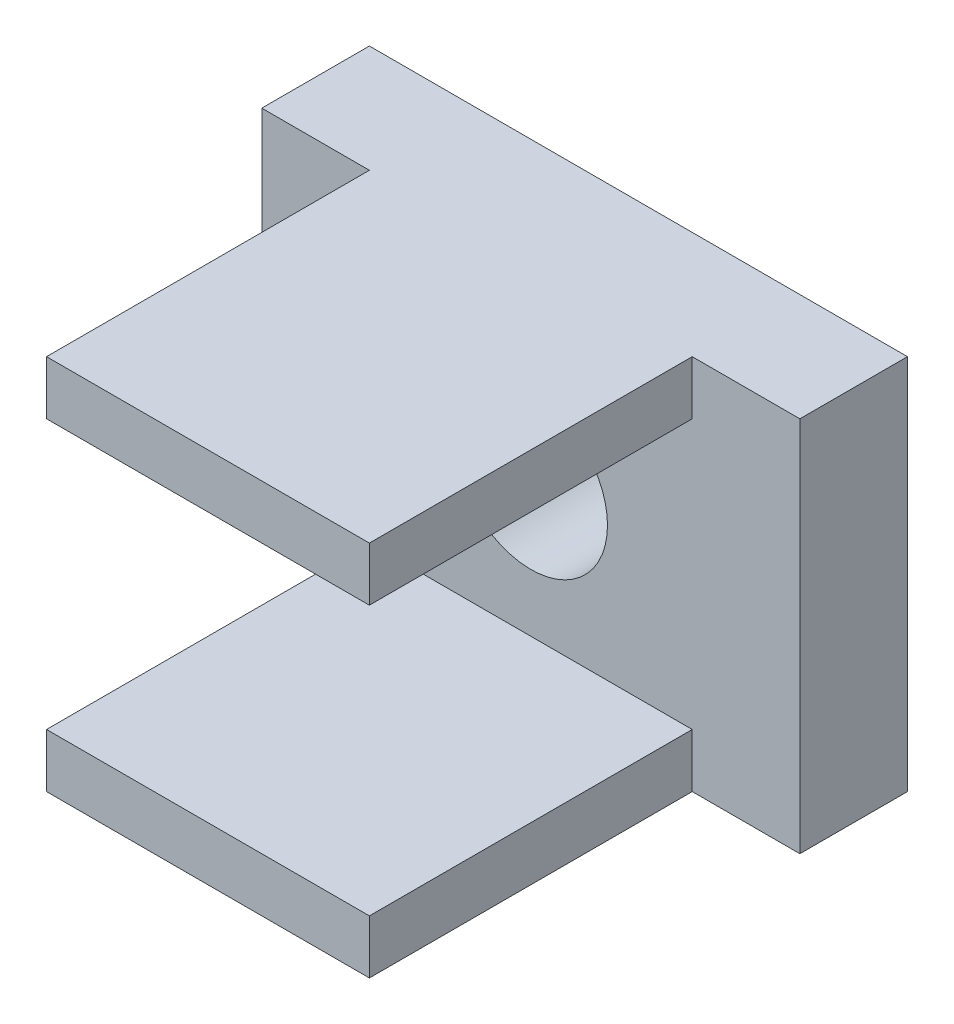
ISO-10303-21;
HEADER;
FILE_DESCRIPTION(('STEP AP214'),'2;1');
FILE_NAME('part.step','',(''),(''),'','','');
FILE_SCHEMA(('AUTOMOTIVE_DESIGN { 1 0 10303 214 1 1 1 1 }'));
ENDSEC;
DATA;
#1=APPLICATION_CONTEXT('core data for automotive mechanical design processes');
#2=APPLICATION_PROTOCOL_DEFINITION('international standard','automotive_design',2000,#1);
#3=PRODUCT_CONTEXT('',#1,'mechanical');
#4=PRODUCT('Part','Part','',(#3));
#5=PRODUCT_RELATED_PRODUCT_CATEGORY('part','',(#4));
#6=PRODUCT_DEFINITION_FORMATION('','',#4);
#7=PRODUCT_DEFINITION_CONTEXT('part definition',#1,'design');
#8=PRODUCT_DEFINITION('design','',#6,#7);
#9=PRODUCT_DEFINITION_SHAPE('','',#8);
#10=(LENGTH_UNIT() NAMED_UNIT(*) SI_UNIT(.MILLI.,.METRE.));
#11=(NAMED_UNIT(*) PLANE_ANGLE_UNIT() SI_UNIT($,.RADIAN.));
#12=(NAMED_UNIT(*) SI_UNIT($,.STERADIAN.) SOLID_ANGLE_UNIT());
#13=UNCERTAINTY_MEASURE_WITH_UNIT(LENGTH_MEASURE(1.E-05),#10,'distance_accuracy_value','');
#14=(GEOMETRIC_REPRESENTATION_CONTEXT(3) GLOBAL_UNCERTAINTY_ASSIGNED_CONTEXT((#13)) GLOBAL_UNIT_ASSIGNED_CONTEXT((#10,
#11,#12)) REPRESENTATION_CONTEXT('',''));
#15=CARTESIAN_POINT('',(0.,0.,0.));
#16=DIRECTION('',(0.,0.,1.));
#17=DIRECTION('',(1.,0.,0.));
#18=AXIS2_PLACEMENT_3D('',#15,#16,#17);
#19=CARTESIAN_POINT('',(-5.,-3.5,2.));
#20=DIRECTION('',(1.,0.,0.));
#21=DIRECTION('',(0.,0.,-1.));
#22=AXIS2_PLACEMENT_3D('',#19,#20,#21);
#23=PLANE('',#22);
#24=DIRECTION('',(0.,-1.,0.));
#25=VECTOR('',#24,1.);
#26=CARTESIAN_POINT('',(-5.,-3.5,0.));
#27=LINE('',#26,#25);
#28=CARTESIAN_POINT('',(-5.,3.5,0.));
#29=VERTEX_POINT('',#28);
#30=CARTESIAN_POINT('',(-5.,-3.5,0.));
#31=VERTEX_POINT('',#30);
#32=EDGE_CURVE('E220',#29,#31,#27,.T.);
#33=ORIENTED_EDGE('',*,*,#32,.T.);
#34=DIRECTION('',(0.,0.,-1.));
#35=VECTOR('',#34,1.);
#36=CARTESIAN_POINT('',(-5.,-3.5,2.));
#37=LINE('',#36,#35);
#38=CARTESIAN_POINT('',(-5.,-3.5,2.));
#39=VERTEX_POINT('',#38);
#40=EDGE_CURVE('E11',#39,#31,#37,.T.);
#41=ORIENTED_EDGE('',*,*,#40,.F.);
#42=DIRECTION('',(0.,-1.,0.));
#43=VECTOR('',#42,1.);
#44=CARTESIAN_POINT('',(-5.,-3.5,2.));
#45=LINE('',#44,#43);
#46=CARTESIAN_POINT('',(-5.,3.5,2.));
#47=VERTEX_POINT('',#46);
#48=EDGE_CURVE('E224',#47,#39,#45,.T.);
#49=ORIENTED_EDGE('',*,*,#48,.F.);
#50=DIRECTION('',(0.,0.,-1.));
#51=VECTOR('',#50,1.);
#52=CARTESIAN_POINT('',(-5.,3.5,2.));
#53=LINE('',#52,#51);
#54=EDGE_CURVE('E240',#47,#29,#53,.T.);
#55=ORIENTED_EDGE('',*,*,#54,.T.);
#56=EDGE_LOOP('',(#33,#41,#49,#55));
#57=FACE_BOUND('',#56,.T.);
#58=ADVANCED_FACE('F39',(#57),#23,.F.);
#59=CARTESIAN_POINT('',(5.,-3.5,2.));
#60=DIRECTION('',(0.,1.,0.));
#61=DIRECTION('',(-1.,0.,0.));
#62=AXIS2_PLACEMENT_3D('',#59,#60,#61);
#63=PLANE('',#62);
#64=DIRECTION('',(1.,0.,0.));
#65=VECTOR('',#64,1.);
#66=CARTESIAN_POINT('',(5.,-3.5,0.));
#67=LINE('',#66,#65);
#68=CARTESIAN_POINT('',(5.,-3.5,0.));
#69=VERTEX_POINT('',#68);
#70=EDGE_CURVE('E244',#31,#69,#67,.T.);
#71=ORIENTED_EDGE('',*,*,#70,.T.);
#72=DIRECTION('',(0.,0.,-1.));
#73=VECTOR('',#72,1.);
#74=CARTESIAN_POINT('',(5.,-3.5,2.));
#75=LINE('',#74,#73);
#76=CARTESIAN_POINT('',(5.,-3.5,2.));
#77=VERTEX_POINT('',#76);
#78=EDGE_CURVE('E47',#77,#69,#75,.T.);
#79=ORIENTED_EDGE('',*,*,#78,.F.);
#80=DIRECTION('',(1.,0.,0.));
#81=VECTOR('',#80,1.);
#82=CARTESIAN_POINT('',(5.,-3.5,2.));
#83=LINE('',#82,#81);
#84=CARTESIAN_POINT('',(3.,-3.5,2.));
#85=VERTEX_POINT('',#84);
#86=EDGE_CURVE('E228',#85,#77,#83,.T.);
#87=ORIENTED_EDGE('',*,*,#86,.F.);
#88=DIRECTION('',(0.,0.,-1.));
#89=VECTOR('',#88,1.);
#90=CARTESIAN_POINT('',(3.,-3.5,8.));
#91=LINE('',#90,#89);
#92=CARTESIAN_POINT('',(3.,-3.5,8.));
#93=VERTEX_POINT('',#92);
#94=EDGE_CURVE('E139',#93,#85,#91,.T.);
#95=ORIENTED_EDGE('',*,*,#94,.F.);
#96=DIRECTION('',(-1.,0.,0.));
#97=VECTOR('',#96,1.);
#98=CARTESIAN_POINT('',(-3.,-3.5,8.));
#99=LINE('',#98,#97);
#100=CARTESIAN_POINT('',(-3.,-3.5,8.));
#101=VERTEX_POINT('',#100);
#102=EDGE_CURVE('E145',#93,#101,#99,.T.);
#103=ORIENTED_EDGE('',*,*,#102,.T.);
#104=DIRECTION('',(0.,0.,-1.));
#105=VECTOR('',#104,1.);
#106=CARTESIAN_POINT('',(-3.,-3.5,8.));
#107=LINE('',#106,#105);
#108=CARTESIAN_POINT('',(-3.,-3.5,2.));
#109=VERTEX_POINT('',#108);
#110=EDGE_CURVE('E128',#101,#109,#107,.T.);
#111=ORIENTED_EDGE('',*,*,#110,.T.);
#112=EDGE_CURVE('E230',#39,#109,#83,.T.);
#113=ORIENTED_EDGE('',*,*,#112,.F.);
#114=ORIENTED_EDGE('',*,*,#40,.T.);
#115=EDGE_LOOP('',(#71,#79,#87,#95,#103,#111,#113,#114));
#116=FACE_BOUND('',#115,.T.);
#117=ADVANCED_FACE('F151',(#116),#63,.F.);
#118=CARTESIAN_POINT('',(5.,-3.5,2.));
#119=DIRECTION('',(-1.,0.,0.));
#120=DIRECTION('',(0.,0.,1.));
#121=AXIS2_PLACEMENT_3D('',#118,#119,#120);
#122=PLANE('',#121);
#123=DIRECTION('',(0.,1.,0.));
#124=VECTOR('',#123,1.);
#125=CARTESIAN_POINT('',(5.,-3.5,0.));
#126=LINE('',#125,#124);
#127=CARTESIAN_POINT('',(5.,3.5,0.));
#128=VERTEX_POINT('',#127);
#129=EDGE_CURVE('E247',#69,#128,#126,.T.);
#130=ORIENTED_EDGE('',*,*,#129,.T.);
#131=DIRECTION('',(0.,0.,-1.));
#132=VECTOR('',#131,1.);
#133=CARTESIAN_POINT('',(5.,3.5,2.));
#134=LINE('',#133,#132);
#135=CARTESIAN_POINT('',(5.,3.5,2.));
#136=VERTEX_POINT('',#135);
#137=EDGE_CURVE('E255',#136,#128,#134,.T.);
#138=ORIENTED_EDGE('',*,*,#137,.F.);
#139=DIRECTION('',(0.,1.,0.));
#140=VECTOR('',#139,1.);
#141=CARTESIAN_POINT('',(5.,-3.5,2.));
#142=LINE('',#141,#140);
#143=EDGE_CURVE('E233',#77,#136,#142,.T.);
#144=ORIENTED_EDGE('',*,*,#143,.F.);
#145=ORIENTED_EDGE('',*,*,#78,.T.);
#146=EDGE_LOOP('',(#130,#138,#144,#145));
#147=FACE_BOUND('',#146,.T.);
#148=ADVANCED_FACE('F264',(#147),#122,.F.);
#149=CARTESIAN_POINT('',(5.,3.5,2.));
#150=DIRECTION('',(0.,-1.,0.));
#151=DIRECTION('',(1.,0.,0.));
#152=AXIS2_PLACEMENT_3D('',#149,#150,#151);
#153=PLANE('',#152);
#154=DIRECTION('',(-1.,0.,0.));
#155=VECTOR('',#154,1.);
#156=CARTESIAN_POINT('',(5.,3.5,0.));
#157=LINE('',#156,#155);
#158=EDGE_CURVE('E229',#128,#29,#157,.T.);
#159=ORIENTED_EDGE('',*,*,#158,.T.);
#160=ORIENTED_EDGE('',*,*,#54,.F.);
#161=DIRECTION('',(-1.,0.,0.));
#162=VECTOR('',#161,1.);
#163=CARTESIAN_POINT('',(5.,3.5,2.));
#164=LINE('',#163,#162);
#165=CARTESIAN_POINT('',(-3.,3.5,2.));
#166=VERTEX_POINT('',#165);
#167=EDGE_CURVE('E236',#166,#47,#164,.T.);
#168=ORIENTED_EDGE('',*,*,#167,.F.);
#169=DIRECTION('',(0.,0.,-1.));
#170=VECTOR('',#169,1.);
#171=CARTESIAN_POINT('',(-3.,3.5,8.));
#172=LINE('',#171,#170);
#173=CARTESIAN_POINT('',(-3.,3.5,8.));
#174=VERTEX_POINT('',#173);
#175=EDGE_CURVE('E189',#174,#166,#172,.T.);
#176=ORIENTED_EDGE('',*,*,#175,.F.);
#177=DIRECTION('',(-1.,0.,0.));
#178=VECTOR('',#177,1.);
#179=CARTESIAN_POINT('',(-3.,3.5,8.));
#180=LINE('',#179,#178);
#181=CARTESIAN_POINT('',(3.,3.5,8.));
#182=VERTEX_POINT('',#181);
#183=EDGE_CURVE('E186',#182,#174,#180,.T.);
#184=ORIENTED_EDGE('',*,*,#183,.F.);
#185=DIRECTION('',(0.,0.,-1.));
#186=VECTOR('',#185,1.);
#187=CARTESIAN_POINT('',(3.,3.5,8.));
#188=LINE('',#187,#186);
#189=CARTESIAN_POINT('',(3.,3.5,2.));
#190=VERTEX_POINT('',#189);
#191=EDGE_CURVE('E203',#182,#190,#188,.T.);
#192=ORIENTED_EDGE('',*,*,#191,.T.);
#193=EDGE_CURVE('E237',#136,#190,#164,.T.);
#194=ORIENTED_EDGE('',*,*,#193,.F.);
#195=ORIENTED_EDGE('',*,*,#137,.T.);
#196=EDGE_LOOP('',(#159,#160,#168,#176,#184,#192,#194,#195));
#197=FACE_BOUND('',#196,.T.);
#198=ADVANCED_FACE('F272',(#197),#153,.F.);
#199=CARTESIAN_POINT('',(0.,0.,2.));
#200=DIRECTION('',(0.,0.,1.));
#201=DIRECTION('',(1.,0.,0.));
#202=AXIS2_PLACEMENT_3D('',#199,#200,#201);
#203=PLANE('',#202);
#204=DIRECTION('',(0.,1.,0.));
#205=VECTOR('',#204,1.);
#206=CARTESIAN_POINT('',(-3.,-3.5,2.));
#207=LINE('',#206,#205);
#208=CARTESIAN_POINT('',(-3.,-2.5,2.));
#209=VERTEX_POINT('',#208);
#210=EDGE_CURVE('E134',#109,#209,#207,.T.);
#211=ORIENTED_EDGE('',*,*,#210,.T.);
#212=DIRECTION('',(1.,0.,0.));
#213=VECTOR('',#212,1.);
#214=CARTESIAN_POINT('',(-3.,-2.5,2.));
#215=LINE('',#214,#213);
#216=CARTESIAN_POINT('',(3.,-2.5,2.));
#217=VERTEX_POINT('',#216);
#218=EDGE_CURVE('E54',#209,#217,#215,.T.);
#219=ORIENTED_EDGE('',*,*,#218,.T.);
#220=DIRECTION('',(0.,-1.,0.));
#221=VECTOR('',#220,1.);
#222=CARTESIAN_POINT('',(3.,-3.5,2.));
#223=LINE('',#222,#221);
#224=EDGE_CURVE('E59',#217,#85,#223,.T.);
#225=ORIENTED_EDGE('',*,*,#224,.T.);
#226=ORIENTED_EDGE('',*,*,#86,.T.);
#227=ORIENTED_EDGE('',*,*,#143,.T.);
#228=ORIENTED_EDGE('',*,*,#193,.T.);
#229=DIRECTION('',(0.,1.,0.));
#230=VECTOR('',#229,1.);
#231=CARTESIAN_POINT('',(3.,3.5,2.));
#232=LINE('',#231,#230);
#233=CARTESIAN_POINT('',(3.,2.5,2.));
#234=VERTEX_POINT('',#233);
#235=EDGE_CURVE('E180',#234,#190,#232,.T.);
#236=ORIENTED_EDGE('',*,*,#235,.F.);
#237=DIRECTION('',(1.,0.,0.));
#238=VECTOR('',#237,1.);
#239=CARTESIAN_POINT('',(-3.,2.5,2.));
#240=LINE('',#239,#238);
#241=CARTESIAN_POINT('',(-3.,2.5,2.));
#242=VERTEX_POINT('',#241);
#243=EDGE_CURVE('E193',#242,#234,#240,.T.);
#244=ORIENTED_EDGE('',*,*,#243,.F.);
#245=DIRECTION('',(0.,-1.,0.));
#246=VECTOR('',#245,1.);
#247=CARTESIAN_POINT('',(-3.,3.5,2.));
#248=LINE('',#247,#246);
#249=EDGE_CURVE('E138',#166,#242,#248,.T.);
#250=ORIENTED_EDGE('',*,*,#249,.F.);
#251=ORIENTED_EDGE('',*,*,#167,.T.);
#252=ORIENTED_EDGE('',*,*,#48,.T.);
#253=ORIENTED_EDGE('',*,*,#112,.T.);
#254=EDGE_LOOP('',(#211,#219,#225,#226,#227,#228,#236,#244,#250,#251,#252,#253));
#255=FACE_BOUND('',#254,.T.);
#256=CARTESIAN_POINT('',(0.,0.,2.));
#257=DIRECTION('',(0.,0.,1.));
#258=DIRECTION('',(1.,0.,0.));
#259=AXIS2_PLACEMENT_3D('',#256,#257,#258);
#260=CIRCLE('',#259,1.425);
#261=CARTESIAN_POINT('',(1.425,0.,2.));
#262=VERTEX_POINT('',#261);
#263=EDGE_CURVE('E215',#262,#262,#260,.T.);
#264=ORIENTED_EDGE('',*,*,#263,.F.);
#265=EDGE_LOOP('',(#264));
#266=FACE_BOUND('',#265,.T.);
#267=ADVANCED_FACE('F278',(#255,#266),#203,.T.);
#268=CARTESIAN_POINT('',(0.,0.,0.));
#269=DIRECTION('',(0.,0.,1.));
#270=DIRECTION('',(1.,0.,0.));
#271=AXIS2_PLACEMENT_3D('',#268,#269,#270);
#272=PLANE('',#271);
#273=CARTESIAN_POINT('',(0.,0.,0.));
#274=DIRECTION('',(0.,0.,1.));
#275=DIRECTION('',(1.,0.,0.));
#276=AXIS2_PLACEMENT_3D('',#273,#274,#275);
#277=CIRCLE('',#276,1.425);
#278=CARTESIAN_POINT('',(1.425,0.,0.));
#279=VERTEX_POINT('',#278);
#280=EDGE_CURVE('E216',#279,#279,#277,.T.);
#281=ORIENTED_EDGE('',*,*,#280,.T.);
#282=EDGE_LOOP('',(#281));
#283=FACE_BOUND('',#282,.T.);
#284=ORIENTED_EDGE('',*,*,#32,.F.);
#285=ORIENTED_EDGE('',*,*,#158,.F.);
#286=ORIENTED_EDGE('',*,*,#129,.F.);
#287=ORIENTED_EDGE('',*,*,#70,.F.);
#288=EDGE_LOOP('',(#284,#285,#286,#287));
#289=FACE_BOUND('',#288,.T.);
#290=ADVANCED_FACE('F269',(#283,#289),#272,.F.);
#291=CARTESIAN_POINT('',(0.,0.,0.));
#292=DIRECTION('',(0.,0.,1.));
#293=DIRECTION('',(1.,0.,0.));
#294=AXIS2_PLACEMENT_3D('',#291,#292,#293);
#295=CYLINDRICAL_SURFACE('',#294,1.425);
#296=ORIENTED_EDGE('',*,*,#280,.F.);
#297=EDGE_LOOP('',(#296));
#298=FACE_BOUND('',#297,.T.);
#299=ORIENTED_EDGE('',*,*,#263,.T.);
#300=EDGE_LOOP('',(#299));
#301=FACE_BOUND('',#300,.T.);
#302=ADVANCED_FACE('F308',(#298,#301),#295,.F.);
#303=CARTESIAN_POINT('',(-3.,3.5,8.));
#304=DIRECTION('',(1.,0.,0.));
#305=DIRECTION('',(0.,0.,-1.));
#306=AXIS2_PLACEMENT_3D('',#303,#304,#305);
#307=PLANE('',#306);
#308=ORIENTED_EDGE('',*,*,#249,.T.);
#309=DIRECTION('',(0.,0.,-1.));
#310=VECTOR('',#309,1.);
#311=CARTESIAN_POINT('',(-3.,2.5,8.));
#312=LINE('',#311,#310);
#313=CARTESIAN_POINT('',(-3.,2.5,8.));
#314=VERTEX_POINT('',#313);
#315=EDGE_CURVE('E211',#314,#242,#312,.T.);
#316=ORIENTED_EDGE('',*,*,#315,.F.);
#317=DIRECTION('',(0.,-1.,0.));
#318=VECTOR('',#317,1.);
#319=CARTESIAN_POINT('',(-3.,3.5,8.));
#320=LINE('',#319,#318);
#321=EDGE_CURVE('E175',#174,#314,#320,.T.);
#322=ORIENTED_EDGE('',*,*,#321,.F.);
#323=ORIENTED_EDGE('',*,*,#175,.T.);
#324=EDGE_LOOP('',(#308,#316,#322,#323));
#325=FACE_BOUND('',#324,.T.);
#326=ADVANCED_FACE('F314',(#325),#307,.F.);
#327=CARTESIAN_POINT('',(-3.,2.5,8.));
#328=DIRECTION('',(0.,1.,0.));
#329=DIRECTION('',(-1.,0.,0.));
#330=AXIS2_PLACEMENT_3D('',#327,#328,#329);
#331=PLANE('',#330);
#332=ORIENTED_EDGE('',*,*,#243,.T.);
#333=DIRECTION('',(0.,0.,-1.));
#334=VECTOR('',#333,1.);
#335=CARTESIAN_POINT('',(3.,2.5,8.));
#336=LINE('',#335,#334);
#337=CARTESIAN_POINT('',(3.,2.5,8.));
#338=VERTEX_POINT('',#337);
#339=EDGE_CURVE('E207',#338,#234,#336,.T.);
#340=ORIENTED_EDGE('',*,*,#339,.F.);
#341=DIRECTION('',(1.,0.,0.));
#342=VECTOR('',#341,1.);
#343=CARTESIAN_POINT('',(-3.,2.5,8.));
#344=LINE('',#343,#342);
#345=EDGE_CURVE('E179',#314,#338,#344,.T.);
#346=ORIENTED_EDGE('',*,*,#345,.F.);
#347=ORIENTED_EDGE('',*,*,#315,.T.);
#348=EDGE_LOOP('',(#332,#340,#346,#347));
#349=FACE_BOUND('',#348,.T.);
#350=ADVANCED_FACE('F318',(#349),#331,.F.);
#351=CARTESIAN_POINT('',(3.,3.5,8.));
#352=DIRECTION('',(-1.,0.,0.));
#353=DIRECTION('',(0.,-1.,0.));
#354=AXIS2_PLACEMENT_3D('',#351,#352,#353);
#355=PLANE('',#354);
#356=ORIENTED_EDGE('',*,*,#235,.T.);
#357=ORIENTED_EDGE('',*,*,#191,.F.);
#358=DIRECTION('',(0.,1.,0.));
#359=VECTOR('',#358,1.);
#360=CARTESIAN_POINT('',(3.,3.5,8.));
#361=LINE('',#360,#359);
#362=EDGE_CURVE('E183',#338,#182,#361,.T.);
#363=ORIENTED_EDGE('',*,*,#362,.F.);
#364=ORIENTED_EDGE('',*,*,#339,.T.);
#365=EDGE_LOOP('',(#356,#357,#363,#364));
#366=FACE_BOUND('',#365,.T.);
#367=ADVANCED_FACE('F322',(#366),#355,.F.);
#368=CARTESIAN_POINT('',(0.,0.,8.));
#369=DIRECTION('',(0.,0.,1.));
#370=DIRECTION('',(1.,0.,0.));
#371=AXIS2_PLACEMENT_3D('',#368,#369,#370);
#372=PLANE('',#371);
#373=ORIENTED_EDGE('',*,*,#321,.T.);
#374=ORIENTED_EDGE('',*,*,#345,.T.);
#375=ORIENTED_EDGE('',*,*,#362,.T.);
#376=ORIENTED_EDGE('',*,*,#183,.T.);
#377=EDGE_LOOP('',(#373,#374,#375,#376));
#378=FACE_BOUND('',#377,.T.);
#379=ADVANCED_FACE('F326',(#378),#372,.T.);
#380=CARTESIAN_POINT('',(-3.,-3.5,8.));
#381=DIRECTION('',(-1.,0.,0.));
#382=DIRECTION('',(0.,0.,1.));
#383=AXIS2_PLACEMENT_3D('',#380,#381,#382);
#384=PLANE('',#383);
#385=ORIENTED_EDGE('',*,*,#210,.F.);
#386=ORIENTED_EDGE('',*,*,#110,.F.);
#387=DIRECTION('',(0.,1.,0.));
#388=VECTOR('',#387,1.);
#389=CARTESIAN_POINT('',(-3.,-3.5,8.));
#390=LINE('',#389,#388);
#391=CARTESIAN_POINT('',(-3.,-2.5,8.));
#392=VERTEX_POINT('',#391);
#393=EDGE_CURVE('E132',#101,#392,#390,.T.);
#394=ORIENTED_EDGE('',*,*,#393,.T.);
#395=DIRECTION('',(0.,0.,-1.));
#396=VECTOR('',#395,1.);
#397=CARTESIAN_POINT('',(-3.,-2.5,8.));
#398=LINE('',#397,#396);
#399=EDGE_CURVE('E161',#392,#209,#398,.T.);
#400=ORIENTED_EDGE('',*,*,#399,.T.);
#401=EDGE_LOOP('',(#385,#386,#394,#400));
#402=FACE_BOUND('',#401,.T.);
#403=ADVANCED_FACE('F130',(#402),#384,.T.);
#404=CARTESIAN_POINT('',(3.,-3.5,8.));
#405=DIRECTION('',(1.,0.,0.));
#406=DIRECTION('',(0.,1.,0.));
#407=AXIS2_PLACEMENT_3D('',#404,#405,#406);
#408=PLANE('',#407);
#409=ORIENTED_EDGE('',*,*,#224,.F.);
#410=DIRECTION('',(0.,0.,-1.));
#411=VECTOR('',#410,1.);
#412=CARTESIAN_POINT('',(3.,-2.5,8.));
#413=LINE('',#412,#411);
#414=CARTESIAN_POINT('',(3.,-2.5,8.));
#415=VERTEX_POINT('',#414);
#416=EDGE_CURVE('E170',#415,#217,#413,.T.);
#417=ORIENTED_EDGE('',*,*,#416,.F.);
#418=DIRECTION('',(0.,-1.,0.));
#419=VECTOR('',#418,1.);
#420=CARTESIAN_POINT('',(3.,-3.5,8.));
#421=LINE('',#420,#419);
#422=EDGE_CURVE('E154',#415,#93,#421,.T.);
#423=ORIENTED_EDGE('',*,*,#422,.T.);
#424=ORIENTED_EDGE('',*,*,#94,.T.);
#425=EDGE_LOOP('',(#409,#417,#423,#424));
#426=FACE_BOUND('',#425,.T.);
#427=ADVANCED_FACE('F284',(#426),#408,.T.);
#428=CARTESIAN_POINT('',(-3.,-2.5,8.));
#429=DIRECTION('',(0.,1.,0.));
#430=DIRECTION('',(-1.,0.,0.));
#431=AXIS2_PLACEMENT_3D('',#428,#429,#430);
#432=PLANE('',#431);
#433=ORIENTED_EDGE('',*,*,#218,.F.);
#434=ORIENTED_EDGE('',*,*,#399,.F.);
#435=DIRECTION('',(1.,0.,0.));
#436=VECTOR('',#435,1.);
#437=CARTESIAN_POINT('',(-3.,-2.5,8.));
#438=LINE('',#437,#436);
#439=EDGE_CURVE('E148',#392,#415,#438,.T.);
#440=ORIENTED_EDGE('',*,*,#439,.T.);
#441=ORIENTED_EDGE('',*,*,#416,.T.);
#442=EDGE_LOOP('',(#433,#434,#440,#441));
#443=FACE_BOUND('',#442,.T.);
#444=ADVANCED_FACE('F286',(#443),#432,.T.);
#445=CARTESIAN_POINT('',(0.,0.,8.));
#446=DIRECTION('',(0.,0.,1.));
#447=DIRECTION('',(1.,0.,0.));
#448=AXIS2_PLACEMENT_3D('',#445,#446,#447);
#449=PLANE('',#448);
#450=ORIENTED_EDGE('',*,*,#393,.F.);
#451=ORIENTED_EDGE('',*,*,#102,.F.);
#452=ORIENTED_EDGE('',*,*,#422,.F.);
#453=ORIENTED_EDGE('',*,*,#439,.F.);
#454=EDGE_LOOP('',(#450,#451,#452,#453));
#455=FACE_BOUND('',#454,.T.);
#456=ADVANCED_FACE('F143',(#455),#449,.T.);
#457=CLOSED_SHELL('',(#58,#117,#148,#198,#267,#290,#302,#326,#350,#367,#379,#403,#427,#444,#456));
#458=MANIFOLD_SOLID_BREP('B2',#457);
#459=ADVANCED_BREP_SHAPE_REPRESENTATION('',(#18,#458),#14);
#460=SHAPE_DEFINITION_REPRESENTATION(#9,#459);
ENDSEC;
END-ISO-10303-21;
